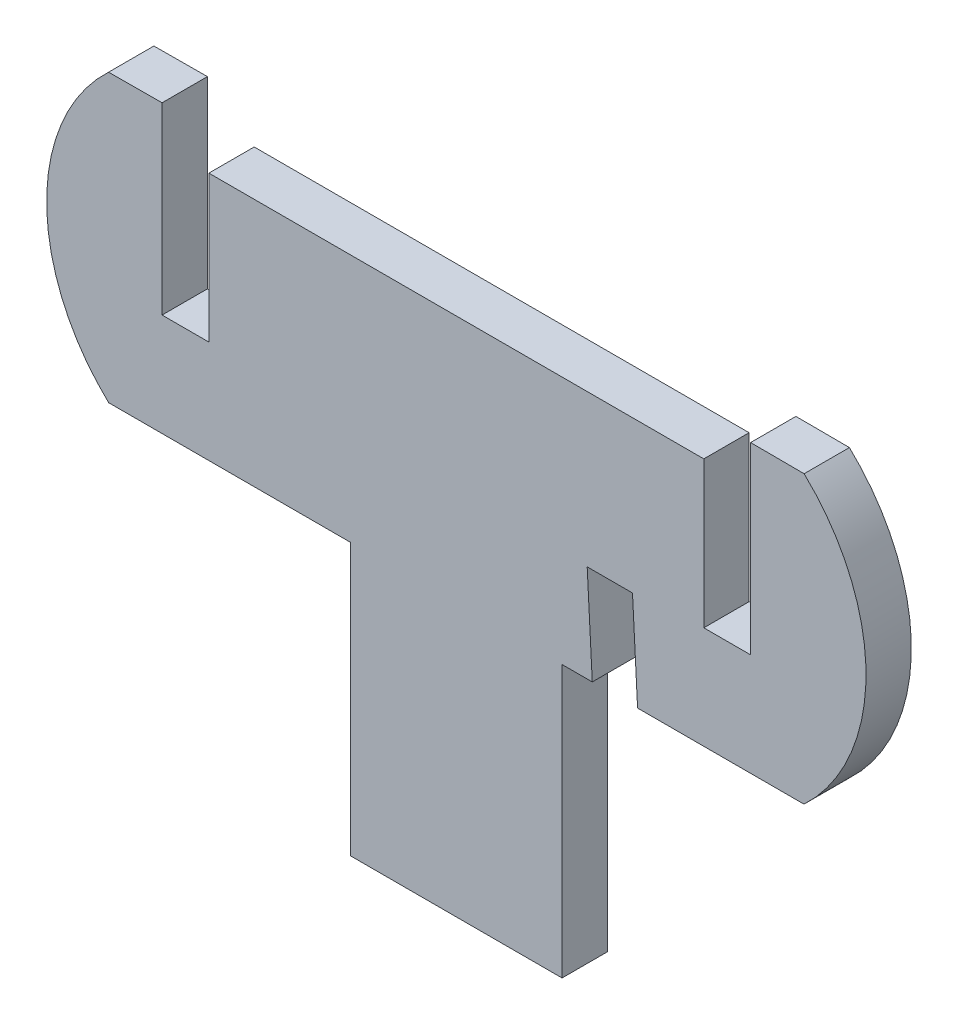
ISO-10303-21;
HEADER;
FILE_DESCRIPTION(('STEP AP214'),'2;1');
FILE_NAME('part.step','',(''),(''),'','','');
FILE_SCHEMA(('AUTOMOTIVE_DESIGN { 1 0 10303 214 1 1 1 1 }'));
ENDSEC;
DATA;
#1=APPLICATION_CONTEXT('core data for automotive mechanical design processes');
#2=APPLICATION_PROTOCOL_DEFINITION('international standard','automotive_design',2000,#1);
#3=PRODUCT_CONTEXT('',#1,'mechanical');
#4=PRODUCT('Part','Part','',(#3));
#5=PRODUCT_RELATED_PRODUCT_CATEGORY('part','',(#4));
#6=PRODUCT_DEFINITION_FORMATION('','',#4);
#7=PRODUCT_DEFINITION_CONTEXT('part definition',#1,'design');
#8=PRODUCT_DEFINITION('design','',#6,#7);
#9=PRODUCT_DEFINITION_SHAPE('','',#8);
#10=(LENGTH_UNIT() NAMED_UNIT(*) SI_UNIT(.MILLI.,.METRE.));
#11=(NAMED_UNIT(*) PLANE_ANGLE_UNIT() SI_UNIT($,.RADIAN.));
#12=(NAMED_UNIT(*) SI_UNIT($,.STERADIAN.) SOLID_ANGLE_UNIT());
#13=UNCERTAINTY_MEASURE_WITH_UNIT(LENGTH_MEASURE(1.E-05),#10,'distance_accuracy_value','');
#14=(GEOMETRIC_REPRESENTATION_CONTEXT(3) GLOBAL_UNCERTAINTY_ASSIGNED_CONTEXT((#13)) GLOBAL_UNIT_ASSIGNED_CONTEXT((#10,
#11,#12)) REPRESENTATION_CONTEXT('',''));
#15=CARTESIAN_POINT('',(0.,0.,0.));
#16=DIRECTION('',(0.,0.,1.));
#17=DIRECTION('',(1.,0.,0.));
#18=AXIS2_PLACEMENT_3D('',#15,#16,#17);
#19=CARTESIAN_POINT('',(457.287518248961,-91.3872368380745,2.99999999999997));
#20=DIRECTION('',(-1.,0.,0.));
#21=DIRECTION('',(0.,0.,1.));
#22=AXIS2_PLACEMENT_3D('',#19,#20,#21);
#23=PLANE('',#22);
#24=DIRECTION('',(0.,1.,0.));
#25=VECTOR('',#24,1.);
#26=CARTESIAN_POINT('',(457.287518248961,-91.3872368380744,0.));
#27=LINE('',#26,#25);
#28=CARTESIAN_POINT('',(457.287518248961,-91.3872368380744,0.));
#29=VERTEX_POINT('',#28);
#30=CARTESIAN_POINT('',(457.287518248961,-79.2146499332662,0.));
#31=VERTEX_POINT('',#30);
#32=EDGE_CURVE('E172',#29,#31,#27,.T.);
#33=ORIENTED_EDGE('',*,*,#32,.T.);
#34=DIRECTION('',(0.,0.,-1.));
#35=VECTOR('',#34,1.);
#36=CARTESIAN_POINT('',(457.287518248961,-79.2146499332662,3.));
#37=LINE('',#36,#35);
#38=CARTESIAN_POINT('',(457.287518248961,-79.2146499332662,3.));
#39=VERTEX_POINT('',#38);
#40=EDGE_CURVE('E11',#39,#31,#37,.T.);
#41=ORIENTED_EDGE('',*,*,#40,.F.);
#42=DIRECTION('',(0.,1.,0.));
#43=VECTOR('',#42,1.);
#44=CARTESIAN_POINT('',(457.287518248961,-91.3872368380745,2.99999999999997));
#45=LINE('',#44,#43);
#46=CARTESIAN_POINT('',(457.287518248961,-91.3872368380745,2.99999999999997));
#47=VERTEX_POINT('',#46);
#48=EDGE_CURVE('E223',#47,#39,#45,.T.);
#49=ORIENTED_EDGE('',*,*,#48,.F.);
#50=DIRECTION('',(0.,0.,-1.));
#51=VECTOR('',#50,1.);
#52=CARTESIAN_POINT('',(457.287518248961,-91.3872368380745,2.99999999999997));
#53=LINE('',#52,#51);
#54=EDGE_CURVE('E185',#47,#29,#53,.T.);
#55=ORIENTED_EDGE('',*,*,#54,.T.);
#56=EDGE_LOOP('',(#33,#41,#49,#55));
#57=FACE_BOUND('',#56,.T.);
#58=ADVANCED_FACE('F32',(#57),#23,.F.);
#59=CARTESIAN_POINT('',(457.287518248961,-79.2146499332662,3.));
#60=DIRECTION('',(0.0044834662198209,-0.999989949214819,0.));
#61=DIRECTION('',(0.999989949214819,0.00448346621982068,0.));
#62=AXIS2_PLACEMENT_3D('',#59,#60,#61);
#63=PLANE('',#62);
#64=DIRECTION('',(-0.999989949214819,-0.00448346621982071,0.));
#65=VECTOR('',#64,1.);
#66=CARTESIAN_POINT('',(457.287518248961,-79.2146499332662,0.));
#67=LINE('',#66,#65);
#68=CARTESIAN_POINT('',(453.745445311414,-79.2305308572456,0.));
#69=VERTEX_POINT('',#68);
#70=EDGE_CURVE('E168',#31,#69,#67,.T.);
#71=ORIENTED_EDGE('',*,*,#70,.T.);
#72=DIRECTION('',(0.,0.,-1.));
#73=VECTOR('',#72,1.);
#74=CARTESIAN_POINT('',(453.745445311414,-79.2305308572456,2.99999999999991));
#75=LINE('',#74,#73);
#76=CARTESIAN_POINT('',(453.745445311414,-79.2305308572456,2.99999999999991));
#77=VERTEX_POINT('',#76);
#78=EDGE_CURVE('E39',#77,#69,#75,.T.);
#79=ORIENTED_EDGE('',*,*,#78,.F.);
#80=DIRECTION('',(-0.999989949214819,-0.00448346621982071,0.));
#81=VECTOR('',#80,1.);
#82=CARTESIAN_POINT('',(457.287518248961,-79.2146499332662,3.));
#83=LINE('',#82,#81);
#84=EDGE_CURVE('E181',#39,#77,#83,.T.);
#85=ORIENTED_EDGE('',*,*,#84,.F.);
#86=ORIENTED_EDGE('',*,*,#40,.T.);
#87=EDGE_LOOP('',(#71,#79,#85,#86));
#88=FACE_BOUND('',#87,.T.);
#89=ADVANCED_FACE('F180',(#88),#63,.F.);
#90=CARTESIAN_POINT('',(462.639150467953,-88.702747484691,2.99999999999998));
#91=DIRECTION('',(0.,0.,-1.));
#92=DIRECTION('',(-1.,0.,0.));
#93=AXIS2_PLACEMENT_3D('',#90,#91,#92);
#94=CYLINDRICAL_SURFACE('',#93,12.9931089139086);
#95=CARTESIAN_POINT('',(462.639150467953,-88.7027474846911,-1.11022302462516E-13));
#96=DIRECTION('',(0.,0.,1.));
#97=DIRECTION('',(-1.,0.,0.));
#98=AXIS2_PLACEMENT_3D('',#95,#96,#97);
#99=CIRCLE('',#98,12.9931089139086);
#100=CARTESIAN_POINT('',(453.753998990681,-98.1829881184847,0.));
#101=VERTEX_POINT('',#100);
#102=EDGE_CURVE('E174',#69,#101,#99,.T.);
#103=ORIENTED_EDGE('',*,*,#102,.T.);
#104=DIRECTION('',(0.,0.,-1.));
#105=VECTOR('',#104,1.);
#106=CARTESIAN_POINT('',(453.753998990681,-98.1829881184847,3.));
#107=LINE('',#106,#105);
#108=CARTESIAN_POINT('',(453.753998990681,-98.1829881184847,3.));
#109=VERTEX_POINT('',#108);
#110=EDGE_CURVE('E309',#109,#101,#107,.T.);
#111=ORIENTED_EDGE('',*,*,#110,.F.);
#112=CARTESIAN_POINT('',(462.639150467953,-88.702747484691,2.99999999999998));
#113=DIRECTION('',(0.,0.,1.));
#114=DIRECTION('',(-1.,0.,0.));
#115=AXIS2_PLACEMENT_3D('',#112,#113,#114);
#116=CIRCLE('',#115,12.9931089139086);
#117=EDGE_CURVE('E226',#77,#109,#116,.T.);
#118=ORIENTED_EDGE('',*,*,#117,.F.);
#119=ORIENTED_EDGE('',*,*,#78,.T.);
#120=EDGE_LOOP('',(#103,#111,#118,#119));
#121=FACE_BOUND('',#120,.T.);
#122=ADVANCED_FACE('F313',(#121),#94,.T.);
#123=CARTESIAN_POINT('',(453.753998990681,-98.1829881184847,3.));
#124=DIRECTION('',(0.,1.,0.));
#125=DIRECTION('',(-1.,0.,0.));
#126=AXIS2_PLACEMENT_3D('',#123,#124,#125);
#127=PLANE('',#126);
#128=DIRECTION('',(1.,0.,0.));
#129=VECTOR('',#128,1.);
#130=CARTESIAN_POINT('',(453.753998990681,-98.1829881184847,0.));
#131=LINE('',#130,#129);
#132=CARTESIAN_POINT('',(469.771556657602,-98.1829881184846,0.));
#133=VERTEX_POINT('',#132);
#134=EDGE_CURVE('E189',#101,#133,#131,.T.);
#135=ORIENTED_EDGE('',*,*,#134,.T.);
#136=DIRECTION('',(0.,0.,-1.));
#137=VECTOR('',#136,1.);
#138=CARTESIAN_POINT('',(469.771556657602,-98.1829881184846,2.99999999999995));
#139=LINE('',#138,#137);
#140=CARTESIAN_POINT('',(469.771556657602,-98.1829881184846,2.99999999999995));
#141=VERTEX_POINT('',#140);
#142=EDGE_CURVE('E306',#141,#133,#139,.T.);
#143=ORIENTED_EDGE('',*,*,#142,.F.);
#144=DIRECTION('',(1.,0.,0.));
#145=VECTOR('',#144,1.);
#146=CARTESIAN_POINT('',(453.753998990681,-98.1829881184847,3.));
#147=LINE('',#146,#145);
#148=EDGE_CURVE('E228',#109,#141,#147,.T.);
#149=ORIENTED_EDGE('',*,*,#148,.F.);
#150=ORIENTED_EDGE('',*,*,#110,.T.);
#151=EDGE_LOOP('',(#135,#143,#149,#150));
#152=FACE_BOUND('',#151,.T.);
#153=ADVANCED_FACE('F321',(#152),#127,.F.);
#154=CARTESIAN_POINT('',(469.765330169001,-116.159839690428,2.99999999999993));
#155=DIRECTION('',(0.999999940016874,-0.000346361441674686,0.));
#156=DIRECTION('',(0.000346361441674603,0.999999940016875,0.));
#157=AXIS2_PLACEMENT_3D('',#154,#155,#156);
#158=PLANE('',#157);
#159=DIRECTION('',(-0.000346361441674603,-0.999999940016874,0.));
#160=VECTOR('',#159,1.);
#161=CARTESIAN_POINT('',(469.765330169001,-116.159839690428,0.));
#162=LINE('',#161,#160);
#163=CARTESIAN_POINT('',(469.765330169001,-116.159839690428,0.));
#164=VERTEX_POINT('',#163);
#165=EDGE_CURVE('E191',#133,#164,#162,.T.);
#166=ORIENTED_EDGE('',*,*,#165,.T.);
#167=DIRECTION('',(0.,0.,-1.));
#168=VECTOR('',#167,1.);
#169=CARTESIAN_POINT('',(469.765330169001,-116.159839690428,2.99999999999993));
#170=LINE('',#169,#168);
#171=CARTESIAN_POINT('',(469.765330169001,-116.159839690428,2.99999999999993));
#172=VERTEX_POINT('',#171);
#173=EDGE_CURVE('E303',#172,#164,#170,.T.);
#174=ORIENTED_EDGE('',*,*,#173,.F.);
#175=DIRECTION('',(-0.000346361441674603,-0.999999940016874,0.));
#176=VECTOR('',#175,1.);
#177=CARTESIAN_POINT('',(469.765330169001,-116.159839690428,2.99999999999993));
#178=LINE('',#177,#176);
#179=EDGE_CURVE('E230',#141,#172,#178,.T.);
#180=ORIENTED_EDGE('',*,*,#179,.F.);
#181=ORIENTED_EDGE('',*,*,#142,.T.);
#182=EDGE_LOOP('',(#166,#174,#180,#181));
#183=FACE_BOUND('',#182,.T.);
#184=ADVANCED_FACE('F324',(#183),#158,.F.);
#185=CARTESIAN_POINT('',(469.765330169001,-116.159839690428,2.99999999999993));
#186=DIRECTION('',(0.,1.,0.));
#187=DIRECTION('',(0.,0.,1.));
#188=AXIS2_PLACEMENT_3D('',#185,#186,#187);
#189=PLANE('',#188);
#190=DIRECTION('',(1.,0.,0.));
#191=VECTOR('',#190,1.);
#192=CARTESIAN_POINT('',(469.765330169001,-116.159839690428,0.));
#193=LINE('',#192,#191);
#194=CARTESIAN_POINT('',(483.771556657602,-116.159839690428,0.));
#195=VERTEX_POINT('',#194);
#196=EDGE_CURVE('E193',#164,#195,#193,.T.);
#197=ORIENTED_EDGE('',*,*,#196,.T.);
#198=DIRECTION('',(0.,0.,-1.));
#199=VECTOR('',#198,1.);
#200=CARTESIAN_POINT('',(483.771556657602,-116.159839690428,2.99999999999991));
#201=LINE('',#200,#199);
#202=CARTESIAN_POINT('',(483.771556657602,-116.159839690428,2.99999999999991));
#203=VERTEX_POINT('',#202);
#204=EDGE_CURVE('E300',#203,#195,#201,.T.);
#205=ORIENTED_EDGE('',*,*,#204,.F.);
#206=DIRECTION('',(1.,0.,0.));
#207=VECTOR('',#206,1.);
#208=CARTESIAN_POINT('',(469.765330169001,-116.159839690428,2.99999999999993));
#209=LINE('',#208,#207);
#210=EDGE_CURVE('E232',#172,#203,#209,.T.);
#211=ORIENTED_EDGE('',*,*,#210,.F.);
#212=ORIENTED_EDGE('',*,*,#173,.T.);
#213=EDGE_LOOP('',(#197,#205,#211,#212));
#214=FACE_BOUND('',#213,.T.);
#215=ADVANCED_FACE('F329',(#214),#189,.F.);
#216=CARTESIAN_POINT('',(483.771556657602,-116.159839690428,2.99999999999991));
#217=DIRECTION('',(-1.,0.,0.));
#218=DIRECTION('',(0.,-1.,0.));
#219=AXIS2_PLACEMENT_3D('',#216,#217,#218);
#220=PLANE('',#219);
#221=DIRECTION('',(0.,1.,0.));
#222=VECTOR('',#221,1.);
#223=CARTESIAN_POINT('',(483.771556657602,-116.159839690428,0.));
#224=LINE('',#223,#222);
#225=CARTESIAN_POINT('',(483.771556657601,-98.1829881184846,0.));
#226=VERTEX_POINT('',#225);
#227=EDGE_CURVE('E195',#195,#226,#224,.T.);
#228=ORIENTED_EDGE('',*,*,#227,.T.);
#229=DIRECTION('',(0.,0.,-1.));
#230=VECTOR('',#229,1.);
#231=CARTESIAN_POINT('',(483.771556657601,-98.1829881184847,2.99999999999991));
#232=LINE('',#231,#230);
#233=CARTESIAN_POINT('',(483.771556657601,-98.1829881184847,2.99999999999991));
#234=VERTEX_POINT('',#233);
#235=EDGE_CURVE('E297',#234,#226,#232,.T.);
#236=ORIENTED_EDGE('',*,*,#235,.F.);
#237=DIRECTION('',(0.,1.,0.));
#238=VECTOR('',#237,1.);
#239=CARTESIAN_POINT('',(483.771556657602,-116.159839690428,2.99999999999991));
#240=LINE('',#239,#238);
#241=EDGE_CURVE('E234',#203,#234,#240,.T.);
#242=ORIENTED_EDGE('',*,*,#241,.F.);
#243=ORIENTED_EDGE('',*,*,#204,.T.);
#244=EDGE_LOOP('',(#228,#236,#242,#243));
#245=FACE_BOUND('',#244,.T.);
#246=ADVANCED_FACE('F335',(#245),#220,.F.);
#247=CARTESIAN_POINT('',(485.771556657602,-98.1829881184847,2.99999999999999));
#248=DIRECTION('',(0.,1.,0.));
#249=DIRECTION('',(-1.,0.,0.));
#250=AXIS2_PLACEMENT_3D('',#247,#248,#249);
#251=PLANE('',#250);
#252=DIRECTION('',(1.,0.,0.));
#253=VECTOR('',#252,1.);
#254=CARTESIAN_POINT('',(485.771556657602,-98.1829881184846,-1.04083408558608E-13));
#255=LINE('',#254,#253);
#256=CARTESIAN_POINT('',(485.771556657602,-98.1829881184846,-1.04083408558608E-13));
#257=VERTEX_POINT('',#256);
#258=EDGE_CURVE('E197',#226,#257,#255,.T.);
#259=ORIENTED_EDGE('',*,*,#258,.T.);
#260=DIRECTION('',(0.,0.,-1.));
#261=VECTOR('',#260,1.);
#262=CARTESIAN_POINT('',(485.771556657602,-98.1829881184847,2.99999999999999));
#263=LINE('',#262,#261);
#264=CARTESIAN_POINT('',(485.771556657602,-98.1829881184847,2.99999999999999));
#265=VERTEX_POINT('',#264);
#266=EDGE_CURVE('E294',#265,#257,#263,.T.);
#267=ORIENTED_EDGE('',*,*,#266,.F.);
#268=DIRECTION('',(1.,0.,0.));
#269=VECTOR('',#268,1.);
#270=CARTESIAN_POINT('',(485.771556657602,-98.1829881184847,2.99999999999999));
#271=LINE('',#270,#269);
#272=EDGE_CURVE('E236',#234,#265,#271,.T.);
#273=ORIENTED_EDGE('',*,*,#272,.F.);
#274=ORIENTED_EDGE('',*,*,#235,.T.);
#275=EDGE_LOOP('',(#259,#267,#273,#274));
#276=FACE_BOUND('',#275,.T.);
#277=ADVANCED_FACE('F339',(#276),#251,.F.);
#278=CARTESIAN_POINT('',(485.434474546092,-91.7510782737816,2.99999999999998));
#279=DIRECTION('',(-0.998629534754574,-0.0523359562429445,0.));
#280=DIRECTION('',(0.0523359562429448,-0.998629534754575,0.));
#281=AXIS2_PLACEMENT_3D('',#278,#279,#280);
#282=PLANE('',#281);
#283=DIRECTION('',(-0.0523359562429448,0.998629534754574,0.));
#284=VECTOR('',#283,1.);
#285=CARTESIAN_POINT('',(485.434474546092,-91.7510782737816,0.));
#286=LINE('',#285,#284);
#287=CARTESIAN_POINT('',(485.434474546092,-91.7510782737816,0.));
#288=VERTEX_POINT('',#287);
#289=EDGE_CURVE('E199',#257,#288,#286,.T.);
#290=ORIENTED_EDGE('',*,*,#289,.T.);
#291=DIRECTION('',(0.,0.,-1.));
#292=VECTOR('',#291,1.);
#293=CARTESIAN_POINT('',(485.434474546092,-91.7510782737816,2.99999999999998));
#294=LINE('',#293,#292);
#295=CARTESIAN_POINT('',(485.434474546092,-91.7510782737816,2.99999999999998));
#296=VERTEX_POINT('',#295);
#297=EDGE_CURVE('E291',#296,#288,#294,.T.);
#298=ORIENTED_EDGE('',*,*,#297,.F.);
#299=DIRECTION('',(-0.0523359562429448,0.998629534754574,0.));
#300=VECTOR('',#299,1.);
#301=CARTESIAN_POINT('',(485.434474546092,-91.7510782737816,2.99999999999998));
#302=LINE('',#301,#300);
#303=EDGE_CURVE('E238',#265,#296,#302,.T.);
#304=ORIENTED_EDGE('',*,*,#303,.F.);
#305=ORIENTED_EDGE('',*,*,#266,.T.);
#306=EDGE_LOOP('',(#290,#298,#304,#305));
#307=FACE_BOUND('',#306,.T.);
#308=ADVANCED_FACE('F344',(#307),#282,.F.);
#309=CARTESIAN_POINT('',(488.434474546092,-91.7510782737815,2.99999999999993));
#310=DIRECTION('',(0.,1.,0.));
#311=DIRECTION('',(-1.,0.,0.));
#312=AXIS2_PLACEMENT_3D('',#309,#310,#311);
#313=PLANE('',#312);
#314=DIRECTION('',(1.,0.,0.));
#315=VECTOR('',#314,1.);
#316=CARTESIAN_POINT('',(488.434474546092,-91.7510782737815,0.));
#317=LINE('',#316,#315);
#318=CARTESIAN_POINT('',(488.434474546092,-91.7510782737815,0.));
#319=VERTEX_POINT('',#318);
#320=EDGE_CURVE('E201',#288,#319,#317,.T.);
#321=ORIENTED_EDGE('',*,*,#320,.T.);
#322=DIRECTION('',(0.,0.,-1.));
#323=VECTOR('',#322,1.);
#324=CARTESIAN_POINT('',(488.434474546092,-91.7510782737815,2.99999999999993));
#325=LINE('',#324,#323);
#326=CARTESIAN_POINT('',(488.434474546092,-91.7510782737815,2.99999999999993));
#327=VERTEX_POINT('',#326);
#328=EDGE_CURVE('E288',#327,#319,#325,.T.);
#329=ORIENTED_EDGE('',*,*,#328,.F.);
#330=DIRECTION('',(1.,0.,0.));
#331=VECTOR('',#330,1.);
#332=CARTESIAN_POINT('',(488.434474546092,-91.7510782737815,2.99999999999993));
#333=LINE('',#332,#331);
#334=EDGE_CURVE('E240',#296,#327,#333,.T.);
#335=ORIENTED_EDGE('',*,*,#334,.F.);
#336=ORIENTED_EDGE('',*,*,#297,.T.);
#337=EDGE_LOOP('',(#321,#329,#335,#336));
#338=FACE_BOUND('',#337,.T.);
#339=ADVANCED_FACE('F350',(#338),#313,.F.);
#340=CARTESIAN_POINT('',(488.434474546092,-91.7510782737815,2.99999999999993));
#341=DIRECTION('',(0.998629534754574,0.052335956242953,0.));
#342=DIRECTION('',(-0.0523359562429534,0.998629534754574,0.));
#343=AXIS2_PLACEMENT_3D('',#340,#341,#342);
#344=PLANE('',#343);
#345=DIRECTION('',(0.0523359562429535,-0.998629534754574,0.));
#346=VECTOR('',#345,1.);
#347=CARTESIAN_POINT('',(488.434474546092,-91.7510782737815,0.));
#348=LINE('',#347,#346);
#349=CARTESIAN_POINT('',(488.771556657602,-98.1829881184846,0.));
#350=VERTEX_POINT('',#349);
#351=EDGE_CURVE('E203',#319,#350,#348,.T.);
#352=ORIENTED_EDGE('',*,*,#351,.T.);
#353=DIRECTION('',(0.,0.,-1.));
#354=VECTOR('',#353,1.);
#355=CARTESIAN_POINT('',(488.771556657602,-98.1829881184846,2.99999999999993));
#356=LINE('',#355,#354);
#357=CARTESIAN_POINT('',(488.771556657602,-98.1829881184846,2.99999999999993));
#358=VERTEX_POINT('',#357);
#359=EDGE_CURVE('E285',#358,#350,#356,.T.);
#360=ORIENTED_EDGE('',*,*,#359,.F.);
#361=DIRECTION('',(0.0523359562429535,-0.998629534754574,0.));
#362=VECTOR('',#361,1.);
#363=CARTESIAN_POINT('',(488.434474546092,-91.7510782737815,2.99999999999993));
#364=LINE('',#363,#362);
#365=EDGE_CURVE('E242',#327,#358,#364,.T.);
#366=ORIENTED_EDGE('',*,*,#365,.F.);
#367=ORIENTED_EDGE('',*,*,#328,.T.);
#368=EDGE_LOOP('',(#352,#360,#366,#367));
#369=FACE_BOUND('',#368,.T.);
#370=ADVANCED_FACE('F354',(#369),#344,.F.);
#371=CARTESIAN_POINT('',(499.789114324522,-98.1829881184847,2.99999999999999));
#372=DIRECTION('',(0.,1.,0.));
#373=DIRECTION('',(-1.,0.,0.));
#374=AXIS2_PLACEMENT_3D('',#371,#372,#373);
#375=PLANE('',#374);
#376=DIRECTION('',(1.,0.,0.));
#377=VECTOR('',#376,1.);
#378=CARTESIAN_POINT('',(499.789114324522,-98.1829881184847,0.));
#379=LINE('',#378,#377);
#380=CARTESIAN_POINT('',(499.789114324522,-98.1829881184847,0.));
#381=VERTEX_POINT('',#380);
#382=EDGE_CURVE('E205',#350,#381,#379,.T.);
#383=ORIENTED_EDGE('',*,*,#382,.T.);
#384=DIRECTION('',(0.,0.,-1.));
#385=VECTOR('',#384,1.);
#386=CARTESIAN_POINT('',(499.789114324522,-98.1829881184847,2.99999999999999));
#387=LINE('',#386,#385);
#388=CARTESIAN_POINT('',(499.789114324522,-98.1829881184847,2.99999999999999));
#389=VERTEX_POINT('',#388);
#390=EDGE_CURVE('E282',#389,#381,#387,.T.);
#391=ORIENTED_EDGE('',*,*,#390,.F.);
#392=DIRECTION('',(1.,0.,0.));
#393=VECTOR('',#392,1.);
#394=CARTESIAN_POINT('',(499.789114324522,-98.1829881184847,2.99999999999999));
#395=LINE('',#394,#393);
#396=EDGE_CURVE('E244',#358,#389,#395,.T.);
#397=ORIENTED_EDGE('',*,*,#396,.F.);
#398=ORIENTED_EDGE('',*,*,#359,.T.);
#399=EDGE_LOOP('',(#383,#391,#397,#398));
#400=FACE_BOUND('',#399,.T.);
#401=ADVANCED_FACE('F359',(#400),#375,.F.);
#402=CARTESIAN_POINT('',(490.90396284725,-88.7027474846911,2.99999999999996));
#403=DIRECTION('',(0.,0.,-1.));
#404=DIRECTION('',(-1.,0.,0.));
#405=AXIS2_PLACEMENT_3D('',#402,#403,#404);
#406=CYLINDRICAL_SURFACE('',#405,12.9931089139086);
#407=CARTESIAN_POINT('',(490.90396284725,-88.702747484691,0.));
#408=DIRECTION('',(0.,0.,1.));
#409=DIRECTION('',(1.,0.,0.));
#410=AXIS2_PLACEMENT_3D('',#407,#408,#409);
#411=CIRCLE('',#410,12.9931089139086);
#412=CARTESIAN_POINT('',(499.797668003789,-79.2305308572457,0.));
#413=VERTEX_POINT('',#412);
#414=EDGE_CURVE('E207',#381,#413,#411,.T.);
#415=ORIENTED_EDGE('',*,*,#414,.T.);
#416=DIRECTION('',(0.,0.,-1.));
#417=VECTOR('',#416,1.);
#418=CARTESIAN_POINT('',(499.797668003789,-79.2305308572456,2.99999999999991));
#419=LINE('',#418,#417);
#420=CARTESIAN_POINT('',(499.797668003789,-79.2305308572456,2.99999999999991));
#421=VERTEX_POINT('',#420);
#422=EDGE_CURVE('E279',#421,#413,#419,.T.);
#423=ORIENTED_EDGE('',*,*,#422,.F.);
#424=CARTESIAN_POINT('',(490.90396284725,-88.7027474846911,2.99999999999996));
#425=DIRECTION('',(0.,0.,1.));
#426=DIRECTION('',(1.,0.,0.));
#427=AXIS2_PLACEMENT_3D('',#424,#425,#426);
#428=CIRCLE('',#427,12.9931089139086);
#429=EDGE_CURVE('E246',#389,#421,#428,.T.);
#430=ORIENTED_EDGE('',*,*,#429,.F.);
#431=ORIENTED_EDGE('',*,*,#390,.T.);
#432=EDGE_LOOP('',(#415,#423,#430,#431));
#433=FACE_BOUND('',#432,.T.);
#434=ADVANCED_FACE('F365',(#433),#406,.T.);
#435=CARTESIAN_POINT('',(496.255595066241,-79.2146499332662,3.00000000000002));
#436=DIRECTION('',(-0.00448346621983226,-0.999989949214819,0.));
#437=DIRECTION('',(0.999989949214819,-0.0044834662198325,0.));
#438=AXIS2_PLACEMENT_3D('',#435,#436,#437);
#439=PLANE('',#438);
#440=DIRECTION('',(-0.999989949214819,0.0044834662198325,0.));
#441=VECTOR('',#440,1.);
#442=CARTESIAN_POINT('',(496.255595066241,-79.2146499332662,0.));
#443=LINE('',#442,#441);
#444=CARTESIAN_POINT('',(496.255595066241,-79.2146499332662,0.));
#445=VERTEX_POINT('',#444);
#446=EDGE_CURVE('E209',#413,#445,#443,.T.);
#447=ORIENTED_EDGE('',*,*,#446,.T.);
#448=DIRECTION('',(0.,0.,-1.));
#449=VECTOR('',#448,1.);
#450=CARTESIAN_POINT('',(496.255595066241,-79.2146499332662,3.00000000000002));
#451=LINE('',#450,#449);
#452=CARTESIAN_POINT('',(496.255595066241,-79.2146499332662,3.00000000000002));
#453=VERTEX_POINT('',#452);
#454=EDGE_CURVE('E276',#453,#445,#451,.T.);
#455=ORIENTED_EDGE('',*,*,#454,.F.);
#456=DIRECTION('',(-0.999989949214819,0.0044834662198325,0.));
#457=VECTOR('',#456,1.);
#458=CARTESIAN_POINT('',(496.255595066241,-79.2146499332662,3.00000000000002));
#459=LINE('',#458,#457);
#460=EDGE_CURVE('E248',#421,#453,#459,.T.);
#461=ORIENTED_EDGE('',*,*,#460,.F.);
#462=ORIENTED_EDGE('',*,*,#422,.T.);
#463=EDGE_LOOP('',(#447,#455,#461,#462));
#464=FACE_BOUND('',#463,.T.);
#465=ADVANCED_FACE('F369',(#464),#439,.F.);
#466=CARTESIAN_POINT('',(496.255595066242,-91.3872368380744,2.99999999999993));
#467=DIRECTION('',(1.,0.,0.));
#468=DIRECTION('',(0.,1.,0.));
#469=AXIS2_PLACEMENT_3D('',#466,#467,#468);
#470=PLANE('',#469);
#471=DIRECTION('',(0.,-1.,0.));
#472=VECTOR('',#471,1.);
#473=CARTESIAN_POINT('',(496.255595066242,-91.3872368380745,0.));
#474=LINE('',#473,#472);
#475=CARTESIAN_POINT('',(496.255595066242,-91.3872368380745,0.));
#476=VERTEX_POINT('',#475);
#477=EDGE_CURVE('E211',#445,#476,#474,.T.);
#478=ORIENTED_EDGE('',*,*,#477,.T.);
#479=DIRECTION('',(0.,0.,-1.));
#480=VECTOR('',#479,1.);
#481=CARTESIAN_POINT('',(496.255595066242,-91.3872368380744,2.99999999999993));
#482=LINE('',#481,#480);
#483=CARTESIAN_POINT('',(496.255595066242,-91.3872368380744,2.99999999999993));
#484=VERTEX_POINT('',#483);
#485=EDGE_CURVE('E273',#484,#476,#482,.T.);
#486=ORIENTED_EDGE('',*,*,#485,.F.);
#487=DIRECTION('',(0.,-1.,0.));
#488=VECTOR('',#487,1.);
#489=CARTESIAN_POINT('',(496.255595066242,-91.3872368380744,2.99999999999993));
#490=LINE('',#489,#488);
#491=EDGE_CURVE('E250',#453,#484,#490,.T.);
#492=ORIENTED_EDGE('',*,*,#491,.F.);
#493=ORIENTED_EDGE('',*,*,#454,.T.);
#494=EDGE_LOOP('',(#478,#486,#492,#493));
#495=FACE_BOUND('',#494,.T.);
#496=ADVANCED_FACE('F374',(#495),#470,.F.);
#497=CARTESIAN_POINT('',(493.156556657602,-91.3872368380744,2.99999999999992));
#498=DIRECTION('',(0.,-1.,0.));
#499=DIRECTION('',(0.,0.,-1.));
#500=AXIS2_PLACEMENT_3D('',#497,#498,#499);
#501=PLANE('',#500);
#502=DIRECTION('',(-1.,0.,0.));
#503=VECTOR('',#502,1.);
#504=CARTESIAN_POINT('',(493.156556657602,-91.3872368380745,0.));
#505=LINE('',#504,#503);
#506=CARTESIAN_POINT('',(493.156556657602,-91.3872368380745,0.));
#507=VERTEX_POINT('',#506);
#508=EDGE_CURVE('E213',#476,#507,#505,.T.);
#509=ORIENTED_EDGE('',*,*,#508,.T.);
#510=DIRECTION('',(0.,0.,-1.));
#511=VECTOR('',#510,1.);
#512=CARTESIAN_POINT('',(493.156556657602,-91.3872368380744,2.99999999999992));
#513=LINE('',#512,#511);
#514=CARTESIAN_POINT('',(493.156556657602,-91.3872368380744,2.99999999999992));
#515=VERTEX_POINT('',#514);
#516=EDGE_CURVE('E270',#515,#507,#513,.T.);
#517=ORIENTED_EDGE('',*,*,#516,.F.);
#518=DIRECTION('',(-1.,0.,0.));
#519=VECTOR('',#518,1.);
#520=CARTESIAN_POINT('',(493.156556657602,-91.3872368380744,2.99999999999992));
#521=LINE('',#520,#519);
#522=EDGE_CURVE('E252',#484,#515,#521,.T.);
#523=ORIENTED_EDGE('',*,*,#522,.F.);
#524=ORIENTED_EDGE('',*,*,#485,.T.);
#525=EDGE_LOOP('',(#509,#517,#523,#524));
#526=FACE_BOUND('',#525,.T.);
#527=ADVANCED_FACE('F380',(#526),#501,.F.);
#528=CARTESIAN_POINT('',(493.156556657602,-81.6989723514752,2.99999999999993));
#529=DIRECTION('',(-1.,0.,0.));
#530=DIRECTION('',(0.,0.,1.));
#531=AXIS2_PLACEMENT_3D('',#528,#529,#530);
#532=PLANE('',#531);
#533=DIRECTION('',(0.,1.,0.));
#534=VECTOR('',#533,1.);
#535=CARTESIAN_POINT('',(493.156556657602,-81.6989723514752,0.));
#536=LINE('',#535,#534);
#537=CARTESIAN_POINT('',(493.156556657602,-81.6989723514752,0.));
#538=VERTEX_POINT('',#537);
#539=EDGE_CURVE('E215',#507,#538,#536,.T.);
#540=ORIENTED_EDGE('',*,*,#539,.T.);
#541=DIRECTION('',(0.,0.,-1.));
#542=VECTOR('',#541,1.);
#543=CARTESIAN_POINT('',(493.156556657602,-81.6989723514752,2.99999999999993));
#544=LINE('',#543,#542);
#545=CARTESIAN_POINT('',(493.156556657602,-81.6989723514752,2.99999999999993));
#546=VERTEX_POINT('',#545);
#547=EDGE_CURVE('E267',#546,#538,#544,.T.);
#548=ORIENTED_EDGE('',*,*,#547,.F.);
#549=DIRECTION('',(0.,1.,0.));
#550=VECTOR('',#549,1.);
#551=CARTESIAN_POINT('',(493.156556657602,-81.6989723514752,2.99999999999993));
#552=LINE('',#551,#550);
#553=EDGE_CURVE('E254',#515,#546,#552,.T.);
#554=ORIENTED_EDGE('',*,*,#553,.F.);
#555=ORIENTED_EDGE('',*,*,#516,.T.);
#556=EDGE_LOOP('',(#540,#548,#554,#555));
#557=FACE_BOUND('',#556,.T.);
#558=ADVANCED_FACE('F384',(#557),#532,.F.);
#559=CARTESIAN_POINT('',(493.156556657602,-81.6989723514752,2.99999999999993));
#560=DIRECTION('',(0.,-1.,0.));
#561=DIRECTION('',(0.,0.,-1.));
#562=AXIS2_PLACEMENT_3D('',#559,#560,#561);
#563=PLANE('',#562);
#564=DIRECTION('',(-1.,0.,0.));
#565=VECTOR('',#564,1.);
#566=CARTESIAN_POINT('',(493.156556657602,-81.6989723514752,0.));
#567=LINE('',#566,#565);
#568=CARTESIAN_POINT('',(460.386556657602,-81.6989723514752,0.));
#569=VERTEX_POINT('',#568);
#570=EDGE_CURVE('E217',#538,#569,#567,.T.);
#571=ORIENTED_EDGE('',*,*,#570,.T.);
#572=DIRECTION('',(0.,0.,-1.));
#573=VECTOR('',#572,1.);
#574=CARTESIAN_POINT('',(460.386556657602,-81.6989723514752,2.99999999999995));
#575=LINE('',#574,#573);
#576=CARTESIAN_POINT('',(460.386556657602,-81.6989723514752,2.99999999999995));
#577=VERTEX_POINT('',#576);
#578=EDGE_CURVE('E264',#577,#569,#575,.T.);
#579=ORIENTED_EDGE('',*,*,#578,.F.);
#580=DIRECTION('',(-1.,0.,0.));
#581=VECTOR('',#580,1.);
#582=CARTESIAN_POINT('',(493.156556657602,-81.6989723514752,2.99999999999993));
#583=LINE('',#582,#581);
#584=EDGE_CURVE('E256',#546,#577,#583,.T.);
#585=ORIENTED_EDGE('',*,*,#584,.F.);
#586=ORIENTED_EDGE('',*,*,#547,.T.);
#587=EDGE_LOOP('',(#571,#579,#585,#586));
#588=FACE_BOUND('',#587,.T.);
#589=ADVANCED_FACE('F389',(#588),#563,.F.);
#590=CARTESIAN_POINT('',(460.386556657602,-81.6989723514752,2.99999999999995));
#591=DIRECTION('',(1.,0.,0.));
#592=DIRECTION('',(0.,0.,-1.));
#593=AXIS2_PLACEMENT_3D('',#590,#591,#592);
#594=PLANE('',#593);
#595=DIRECTION('',(0.,-1.,0.));
#596=VECTOR('',#595,1.);
#597=CARTESIAN_POINT('',(460.386556657602,-81.6989723514752,0.));
#598=LINE('',#597,#596);
#599=CARTESIAN_POINT('',(460.386556657602,-91.3872368380745,0.));
#600=VERTEX_POINT('',#599);
#601=EDGE_CURVE('E219',#569,#600,#598,.T.);
#602=ORIENTED_EDGE('',*,*,#601,.T.);
#603=DIRECTION('',(0.,0.,-1.));
#604=VECTOR('',#603,1.);
#605=CARTESIAN_POINT('',(460.386556657602,-91.3872368380745,2.99999999999993));
#606=LINE('',#605,#604);
#607=CARTESIAN_POINT('',(460.386556657602,-91.3872368380745,2.99999999999993));
#608=VERTEX_POINT('',#607);
#609=EDGE_CURVE('E261',#608,#600,#606,.T.);
#610=ORIENTED_EDGE('',*,*,#609,.F.);
#611=DIRECTION('',(0.,-1.,0.));
#612=VECTOR('',#611,1.);
#613=CARTESIAN_POINT('',(460.386556657602,-81.6989723514752,2.99999999999995));
#614=LINE('',#613,#612);
#615=EDGE_CURVE('E51',#577,#608,#614,.T.);
#616=ORIENTED_EDGE('',*,*,#615,.F.);
#617=ORIENTED_EDGE('',*,*,#578,.T.);
#618=EDGE_LOOP('',(#602,#610,#616,#617));
#619=FACE_BOUND('',#618,.T.);
#620=ADVANCED_FACE('F392',(#619),#594,.F.);
#621=CARTESIAN_POINT('',(460.386556657602,-91.3872368380745,2.99999999999993));
#622=DIRECTION('',(0.,-1.,0.));
#623=DIRECTION('',(0.,0.,-1.));
#624=AXIS2_PLACEMENT_3D('',#621,#622,#623);
#625=PLANE('',#624);
#626=DIRECTION('',(-1.,0.,0.));
#627=VECTOR('',#626,1.);
#628=CARTESIAN_POINT('',(460.386556657602,-91.3872368380745,0.));
#629=LINE('',#628,#627);
#630=EDGE_CURVE('E221',#600,#29,#629,.T.);
#631=ORIENTED_EDGE('',*,*,#630,.T.);
#632=ORIENTED_EDGE('',*,*,#54,.F.);
#633=DIRECTION('',(-1.,0.,0.));
#634=VECTOR('',#633,1.);
#635=CARTESIAN_POINT('',(460.386556657602,-91.3872368380745,2.99999999999993));
#636=LINE('',#635,#634);
#637=EDGE_CURVE('E46',#608,#47,#636,.T.);
#638=ORIENTED_EDGE('',*,*,#637,.F.);
#639=ORIENTED_EDGE('',*,*,#609,.T.);
#640=EDGE_LOOP('',(#631,#632,#638,#639));
#641=FACE_BOUND('',#640,.T.);
#642=ADVANCED_FACE('F394',(#641),#625,.F.);
#643=CARTESIAN_POINT('',(462.639150467953,-88.702747484691,2.99999999999998));
#644=DIRECTION('',(0.,0.,-1.));
#645=DIRECTION('',(-1.,0.,0.));
#646=AXIS2_PLACEMENT_3D('',#643,#644,#645);
#647=PLANE('',#646);
#648=ORIENTED_EDGE('',*,*,#48,.T.);
#649=ORIENTED_EDGE('',*,*,#84,.T.);
#650=ORIENTED_EDGE('',*,*,#117,.T.);
#651=ORIENTED_EDGE('',*,*,#148,.T.);
#652=ORIENTED_EDGE('',*,*,#179,.T.);
#653=ORIENTED_EDGE('',*,*,#210,.T.);
#654=ORIENTED_EDGE('',*,*,#241,.T.);
#655=ORIENTED_EDGE('',*,*,#272,.T.);
#656=ORIENTED_EDGE('',*,*,#303,.T.);
#657=ORIENTED_EDGE('',*,*,#334,.T.);
#658=ORIENTED_EDGE('',*,*,#365,.T.);
#659=ORIENTED_EDGE('',*,*,#396,.T.);
#660=ORIENTED_EDGE('',*,*,#429,.T.);
#661=ORIENTED_EDGE('',*,*,#460,.T.);
#662=ORIENTED_EDGE('',*,*,#491,.T.);
#663=ORIENTED_EDGE('',*,*,#522,.T.);
#664=ORIENTED_EDGE('',*,*,#553,.T.);
#665=ORIENTED_EDGE('',*,*,#584,.T.);
#666=ORIENTED_EDGE('',*,*,#615,.T.);
#667=ORIENTED_EDGE('',*,*,#637,.T.);
#668=EDGE_LOOP('',(#648,#649,#650,#651,#652,#653,#654,#655,#656,#657,#658,#659,#660,#661,#662,
#663,#664,#665,#666,#667));
#669=FACE_BOUND('',#668,.T.);
#670=ADVANCED_FACE('F316',(#669),#647,.F.);
#671=CARTESIAN_POINT('',(462.639150467953,-88.7027474846911,-1.11022302462516E-13));
#672=DIRECTION('',(0.,0.,-1.));
#673=DIRECTION('',(-1.,0.,0.));
#674=AXIS2_PLACEMENT_3D('',#671,#672,#673);
#675=PLANE('',#674);
#676=ORIENTED_EDGE('',*,*,#32,.F.);
#677=ORIENTED_EDGE('',*,*,#630,.F.);
#678=ORIENTED_EDGE('',*,*,#601,.F.);
#679=ORIENTED_EDGE('',*,*,#570,.F.);
#680=ORIENTED_EDGE('',*,*,#539,.F.);
#681=ORIENTED_EDGE('',*,*,#508,.F.);
#682=ORIENTED_EDGE('',*,*,#477,.F.);
#683=ORIENTED_EDGE('',*,*,#446,.F.);
#684=ORIENTED_EDGE('',*,*,#414,.F.);
#685=ORIENTED_EDGE('',*,*,#382,.F.);
#686=ORIENTED_EDGE('',*,*,#351,.F.);
#687=ORIENTED_EDGE('',*,*,#320,.F.);
#688=ORIENTED_EDGE('',*,*,#289,.F.);
#689=ORIENTED_EDGE('',*,*,#258,.F.);
#690=ORIENTED_EDGE('',*,*,#227,.F.);
#691=ORIENTED_EDGE('',*,*,#196,.F.);
#692=ORIENTED_EDGE('',*,*,#165,.F.);
#693=ORIENTED_EDGE('',*,*,#134,.F.);
#694=ORIENTED_EDGE('',*,*,#102,.F.);
#695=ORIENTED_EDGE('',*,*,#70,.F.);
#696=EDGE_LOOP('',(#676,#677,#678,#679,#680,#681,#682,#683,#684,#685,#686,#687,#688,#689,#690,
#691,#692,#693,#694,#695));
#697=FACE_BOUND('',#696,.T.);
#698=ADVANCED_FACE('F169',(#697),#675,.T.);
#699=CLOSED_SHELL('',(#58,#89,#122,#153,#184,#215,#246,#277,#308,#339,#370,#401,#434,#465,#496,
#527,#558,#589,#620,#642,#670,#698));
#700=MANIFOLD_SOLID_BREP('B2',#699);
#701=ADVANCED_BREP_SHAPE_REPRESENTATION('',(#18,#700),#14);
#702=SHAPE_DEFINITION_REPRESENTATION(#9,#701);
ENDSEC;
END-ISO-10303-21;
